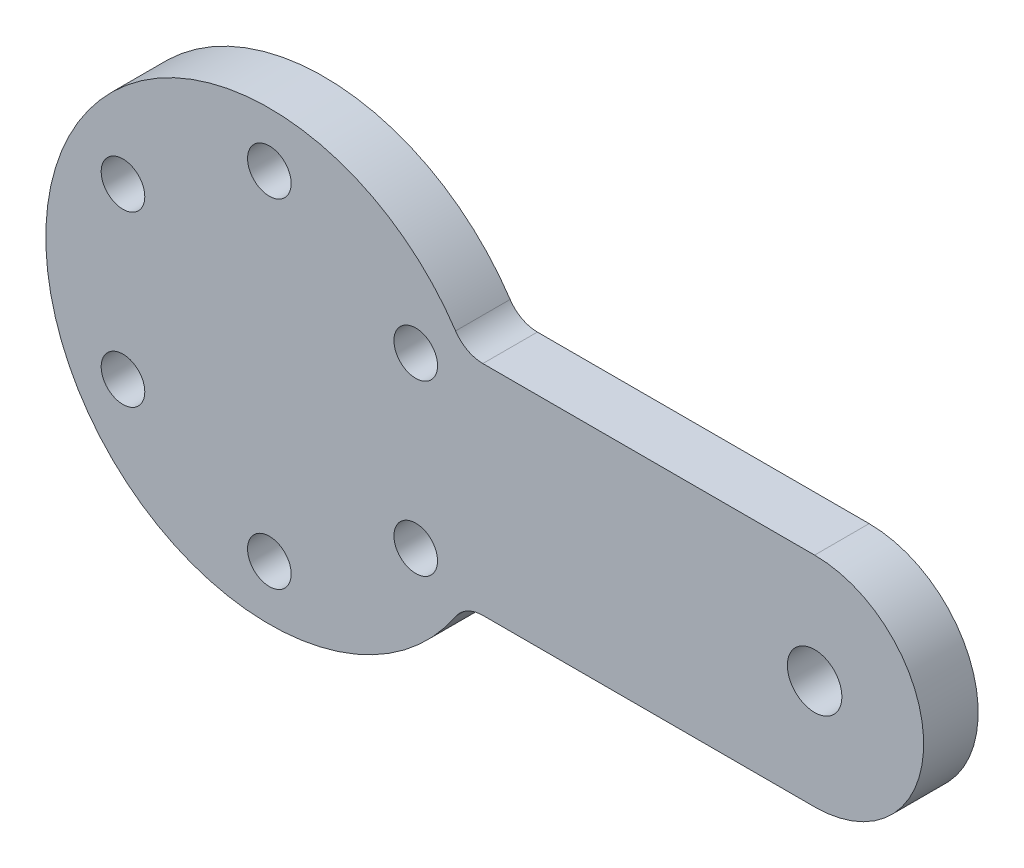
ISO-10303-21;
HEADER;
FILE_DESCRIPTION(('STEP AP214'),'2;1');
FILE_NAME('part.step','',(''),(''),'','','');
FILE_SCHEMA(('AUTOMOTIVE_DESIGN { 1 0 10303 214 1 1 1 1 }'));
ENDSEC;
DATA;
#1=APPLICATION_CONTEXT('core data for automotive mechanical design processes');
#2=APPLICATION_PROTOCOL_DEFINITION('international standard','automotive_design',2000,#1);
#3=PRODUCT_CONTEXT('',#1,'mechanical');
#4=PRODUCT('Part','Part','',(#3));
#5=PRODUCT_RELATED_PRODUCT_CATEGORY('part','',(#4));
#6=PRODUCT_DEFINITION_FORMATION('','',#4);
#7=PRODUCT_DEFINITION_CONTEXT('part definition',#1,'design');
#8=PRODUCT_DEFINITION('design','',#6,#7);
#9=PRODUCT_DEFINITION_SHAPE('','',#8);
#10=(LENGTH_UNIT() NAMED_UNIT(*) SI_UNIT(.MILLI.,.METRE.));
#11=(NAMED_UNIT(*) PLANE_ANGLE_UNIT() SI_UNIT($,.RADIAN.));
#12=(NAMED_UNIT(*) SI_UNIT($,.STERADIAN.) SOLID_ANGLE_UNIT());
#13=UNCERTAINTY_MEASURE_WITH_UNIT(LENGTH_MEASURE(1.E-05),#10,'distance_accuracy_value','');
#14=(GEOMETRIC_REPRESENTATION_CONTEXT(3) GLOBAL_UNCERTAINTY_ASSIGNED_CONTEXT((#13)) GLOBAL_UNIT_ASSIGNED_CONTEXT((#10,
#11,#12)) REPRESENTATION_CONTEXT('',''));
#15=CARTESIAN_POINT('',(0.,0.,0.));
#16=DIRECTION('',(0.,0.,1.));
#17=DIRECTION('',(1.,0.,0.));
#18=AXIS2_PLACEMENT_3D('',#15,#16,#17);
#19=CARTESIAN_POINT('',(0.,0.,2.5));
#20=DIRECTION('',(0.,0.,1.));
#21=DIRECTION('',(1.,0.,0.));
#22=AXIS2_PLACEMENT_3D('',#19,#20,#21);
#23=PLANE('',#22);
#24=CARTESIAN_POINT('',(13.4233937586587,7.75000000000016,2.5));
#25=DIRECTION('',(0.,0.,1.));
#26=DIRECTION('',(0.50000000000001,-0.866025403784433,0.));
#27=AXIS2_PLACEMENT_3D('',#24,#25,#26);
#28=CIRCLE('',#27,2.);
#29=CARTESIAN_POINT('',(14.4233937586587,6.01794919243129,2.5));
#30=VERTEX_POINT('',#29);
#31=EDGE_CURVE('E302',#30,#30,#28,.T.);
#32=ORIENTED_EDGE('',*,*,#31,.F.);
#33=EDGE_LOOP('',(#32));
#34=FACE_BOUND('',#33,.T.);
#35=CARTESIAN_POINT('',(13.4233937586589,-7.74999999999987,2.5));
#36=DIRECTION('',(0.,0.,1.));
#37=DIRECTION('',(-0.499999999999992,-0.866025403784443,0.));
#38=AXIS2_PLACEMENT_3D('',#35,#36,#37);
#39=CIRCLE('',#38,2.);
#40=CARTESIAN_POINT('',(12.4233937586589,-9.48205080756876,2.5));
#41=VERTEX_POINT('',#40);
#42=EDGE_CURVE('E288',#41,#41,#39,.T.);
#43=ORIENTED_EDGE('',*,*,#42,.F.);
#44=EDGE_LOOP('',(#43));
#45=FACE_BOUND('',#44,.T.);
#46=CARTESIAN_POINT('',(0.,-15.5,2.5));
#47=DIRECTION('',(0.,0.,1.));
#48=DIRECTION('',(-1.,0.,0.));
#49=AXIS2_PLACEMENT_3D('',#46,#47,#48);
#50=CIRCLE('',#49,2.);
#51=CARTESIAN_POINT('',(-2.,-15.5,2.5));
#52=VERTEX_POINT('',#51);
#53=EDGE_CURVE('E293',#52,#52,#50,.T.);
#54=ORIENTED_EDGE('',*,*,#53,.F.);
#55=EDGE_LOOP('',(#54));
#56=FACE_BOUND('',#55,.T.);
#57=CARTESIAN_POINT('',(-13.4233937586588,-7.75000000000006,2.5));
#58=DIRECTION('',(0.,0.,1.));
#59=DIRECTION('',(-0.500000000000004,0.866025403784436,0.));
#60=AXIS2_PLACEMENT_3D('',#57,#58,#59);
#61=CIRCLE('',#60,2.);
#62=CARTESIAN_POINT('',(-14.4233937586588,-6.01794919243119,2.5));
#63=VERTEX_POINT('',#62);
#64=EDGE_CURVE('E338',#63,#63,#61,.T.);
#65=ORIENTED_EDGE('',*,*,#64,.F.);
#66=EDGE_LOOP('',(#65));
#67=FACE_BOUND('',#66,.T.);
#68=CARTESIAN_POINT('',(-13.4233937586588,7.74999999999997,2.5));
#69=DIRECTION('',(0.,0.,1.));
#70=DIRECTION('',(0.499999999999998,0.86602540378444,0.));
#71=AXIS2_PLACEMENT_3D('',#68,#69,#70);
#72=CIRCLE('',#71,2.);
#73=CARTESIAN_POINT('',(-12.4233937586588,9.48205080756885,2.5));
#74=VERTEX_POINT('',#73);
#75=EDGE_CURVE('E307',#74,#74,#72,.T.);
#76=ORIENTED_EDGE('',*,*,#75,.F.);
#77=EDGE_LOOP('',(#76));
#78=FACE_BOUND('',#77,.T.);
#79=CARTESIAN_POINT('',(0.,15.5,2.5));
#80=DIRECTION('',(0.,0.,1.));
#81=DIRECTION('',(1.,0.,0.));
#82=AXIS2_PLACEMENT_3D('',#79,#80,#81);
#83=CIRCLE('',#82,2.);
#84=CARTESIAN_POINT('',(2.,15.5,2.5));
#85=VERTEX_POINT('',#84);
#86=EDGE_CURVE('E314',#85,#85,#83,.T.);
#87=ORIENTED_EDGE('',*,*,#86,.F.);
#88=EDGE_LOOP('',(#87));
#89=FACE_BOUND('',#88,.T.);
#90=DIRECTION('',(-1.,0.,0.));
#91=VECTOR('',#90,1.);
#92=CARTESIAN_POINT('',(17.8955301681733,10.,2.5));
#93=LINE('',#92,#91);
#94=CARTESIAN_POINT('',(50.,10.,2.5));
#95=VERTEX_POINT('',#94);
#96=CARTESIAN_POINT('',(19.5767719504519,10.,2.5));
#97=VERTEX_POINT('',#96);
#98=EDGE_CURVE('E114',#95,#97,#93,.T.);
#99=ORIENTED_EDGE('',*,*,#98,.T.);
#100=CARTESIAN_POINT('',(19.5767719504519,13.,2.5));
#101=DIRECTION('',(0.,0.,1.));
#102=DIRECTION('',(1.,0.,0.));
#103=AXIS2_PLACEMENT_3D('',#100,#101,#102);
#104=CIRCLE('',#103,3.);
#105=CARTESIAN_POINT('',(17.0776095737985,11.3404255319149,2.5));
#106=VERTEX_POINT('',#105);
#107=EDGE_CURVE('E11',#97,#106,#104,.F.);
#108=ORIENTED_EDGE('',*,*,#107,.T.);
#109=CARTESIAN_POINT('',(0.,0.,2.5));
#110=DIRECTION('',(0.,0.,1.));
#111=DIRECTION('',(1.,0.,0.));
#112=AXIS2_PLACEMENT_3D('',#109,#110,#111);
#113=CIRCLE('',#112,20.5);
#114=CARTESIAN_POINT('',(17.0776095737985,-11.3404255319149,2.5));
#115=VERTEX_POINT('',#114);
#116=EDGE_CURVE('E100',#106,#115,#113,.T.);
#117=ORIENTED_EDGE('',*,*,#116,.T.);
#118=CARTESIAN_POINT('',(19.5767719504519,-13.,2.5));
#119=DIRECTION('',(0.,0.,1.));
#120=DIRECTION('',(1.,0.,0.));
#121=AXIS2_PLACEMENT_3D('',#118,#119,#120);
#122=CIRCLE('',#121,3.);
#123=CARTESIAN_POINT('',(19.5767719504519,-10.,2.5));
#124=VERTEX_POINT('',#123);
#125=EDGE_CURVE('E96',#115,#124,#122,.F.);
#126=ORIENTED_EDGE('',*,*,#125,.T.);
#127=DIRECTION('',(1.,0.,0.));
#128=VECTOR('',#127,1.);
#129=CARTESIAN_POINT('',(17.8955301681733,-10.,2.5));
#130=LINE('',#129,#128);
#131=CARTESIAN_POINT('',(50.,-10.,2.5));
#132=VERTEX_POINT('',#131);
#133=EDGE_CURVE('E88',#124,#132,#130,.T.);
#134=ORIENTED_EDGE('',*,*,#133,.T.);
#135=CARTESIAN_POINT('',(50.,0.,2.5));
#136=DIRECTION('',(0.,0.,1.));
#137=DIRECTION('',(1.,0.,0.));
#138=AXIS2_PLACEMENT_3D('',#135,#136,#137);
#139=CIRCLE('',#138,10.);
#140=EDGE_CURVE('E92',#132,#95,#139,.T.);
#141=ORIENTED_EDGE('',*,*,#140,.T.);
#142=EDGE_LOOP('',(#99,#108,#117,#126,#134,#141));
#143=FACE_BOUND('',#142,.T.);
#144=CARTESIAN_POINT('',(50.,0.,2.5));
#145=DIRECTION('',(0.,0.,1.));
#146=DIRECTION('',(1.,0.,0.));
#147=AXIS2_PLACEMENT_3D('',#144,#145,#146);
#148=CIRCLE('',#147,2.49999999999999);
#149=CARTESIAN_POINT('',(52.5,0.,2.5));
#150=VERTEX_POINT('',#149);
#151=EDGE_CURVE('E122',#150,#150,#148,.T.);
#152=ORIENTED_EDGE('',*,*,#151,.F.);
#153=EDGE_LOOP('',(#152));
#154=FACE_BOUND('',#153,.T.);
#155=ADVANCED_FACE('F36',(#34,#45,#56,#67,#78,#89,#143,#154),#23,.T.);
#156=CARTESIAN_POINT('',(0.,0.,-2.5));
#157=DIRECTION('',(0.,0.,1.));
#158=DIRECTION('',(1.,0.,0.));
#159=AXIS2_PLACEMENT_3D('',#156,#157,#158);
#160=PLANE('',#159);
#161=CARTESIAN_POINT('',(13.4233937586587,7.75000000000016,-2.5));
#162=DIRECTION('',(0.,0.,1.));
#163=DIRECTION('',(1.,0.,0.));
#164=AXIS2_PLACEMENT_3D('',#161,#162,#163);
#165=CIRCLE('',#164,2.);
#166=CARTESIAN_POINT('',(15.4233937586587,7.75000000000016,-2.5));
#167=VERTEX_POINT('',#166);
#168=EDGE_CURVE('E298',#167,#167,#165,.F.);
#169=ORIENTED_EDGE('',*,*,#168,.F.);
#170=EDGE_LOOP('',(#169));
#171=FACE_BOUND('',#170,.T.);
#172=CARTESIAN_POINT('',(13.4233937586589,-7.74999999999987,-2.5));
#173=DIRECTION('',(0.,0.,1.));
#174=DIRECTION('',(1.,0.,0.));
#175=AXIS2_PLACEMENT_3D('',#172,#173,#174);
#176=CIRCLE('',#175,2.);
#177=CARTESIAN_POINT('',(15.4233937586589,-7.74999999999987,-2.5));
#178=VERTEX_POINT('',#177);
#179=EDGE_CURVE('E291',#178,#178,#176,.F.);
#180=ORIENTED_EDGE('',*,*,#179,.F.);
#181=EDGE_LOOP('',(#180));
#182=FACE_BOUND('',#181,.T.);
#183=CARTESIAN_POINT('',(0.,-15.5,-2.5));
#184=DIRECTION('',(0.,0.,1.));
#185=DIRECTION('',(1.,0.,0.));
#186=AXIS2_PLACEMENT_3D('',#183,#184,#185);
#187=CIRCLE('',#186,2.);
#188=CARTESIAN_POINT('',(2.,-15.5,-2.5));
#189=VERTEX_POINT('',#188);
#190=EDGE_CURVE('E296',#189,#189,#187,.F.);
#191=ORIENTED_EDGE('',*,*,#190,.F.);
#192=EDGE_LOOP('',(#191));
#193=FACE_BOUND('',#192,.T.);
#194=CARTESIAN_POINT('',(-13.4233937586588,-7.75000000000006,-2.5));
#195=DIRECTION('',(0.,0.,1.));
#196=DIRECTION('',(1.,0.,0.));
#197=AXIS2_PLACEMENT_3D('',#194,#195,#196);
#198=CIRCLE('',#197,2.);
#199=CARTESIAN_POINT('',(-11.4233937586588,-7.75000000000006,-2.5));
#200=VERTEX_POINT('',#199);
#201=EDGE_CURVE('E311',#200,#200,#198,.F.);
#202=ORIENTED_EDGE('',*,*,#201,.F.);
#203=EDGE_LOOP('',(#202));
#204=FACE_BOUND('',#203,.T.);
#205=CARTESIAN_POINT('',(-13.4233937586588,7.74999999999997,-2.5));
#206=DIRECTION('',(0.,0.,1.));
#207=DIRECTION('',(1.,0.,0.));
#208=AXIS2_PLACEMENT_3D('',#205,#206,#207);
#209=CIRCLE('',#208,2.);
#210=CARTESIAN_POINT('',(-11.4233937586588,7.74999999999997,-2.5));
#211=VERTEX_POINT('',#210);
#212=EDGE_CURVE('E310',#211,#211,#209,.F.);
#213=ORIENTED_EDGE('',*,*,#212,.F.);
#214=EDGE_LOOP('',(#213));
#215=FACE_BOUND('',#214,.T.);
#216=CARTESIAN_POINT('',(0.,15.5,-2.5));
#217=DIRECTION('',(0.,0.,1.));
#218=DIRECTION('',(1.,0.,0.));
#219=AXIS2_PLACEMENT_3D('',#216,#217,#218);
#220=CIRCLE('',#219,2.);
#221=CARTESIAN_POINT('',(2.,15.5,-2.5));
#222=VERTEX_POINT('',#221);
#223=EDGE_CURVE('E317',#222,#222,#220,.F.);
#224=ORIENTED_EDGE('',*,*,#223,.F.);
#225=EDGE_LOOP('',(#224));
#226=FACE_BOUND('',#225,.T.);
#227=CARTESIAN_POINT('',(0.,0.,-2.5));
#228=DIRECTION('',(0.,0.,1.));
#229=DIRECTION('',(1.,0.,0.));
#230=AXIS2_PLACEMENT_3D('',#227,#228,#229);
#231=CIRCLE('',#230,20.5);
#232=CARTESIAN_POINT('',(17.0776095737985,11.3404255319149,-2.5));
#233=VERTEX_POINT('',#232);
#234=CARTESIAN_POINT('',(17.0776095737985,-11.3404255319149,-2.5));
#235=VERTEX_POINT('',#234);
#236=EDGE_CURVE('E119',#233,#235,#231,.T.);
#237=ORIENTED_EDGE('',*,*,#236,.F.);
#238=CARTESIAN_POINT('',(19.5767719504519,13.,-2.5));
#239=DIRECTION('',(0.,0.,1.));
#240=DIRECTION('',(1.,0.,0.));
#241=AXIS2_PLACEMENT_3D('',#238,#239,#240);
#242=CIRCLE('',#241,3.);
#243=CARTESIAN_POINT('',(19.5767719504519,10.,-2.5));
#244=VERTEX_POINT('',#243);
#245=EDGE_CURVE('E44',#233,#244,#242,.T.);
#246=ORIENTED_EDGE('',*,*,#245,.T.);
#247=DIRECTION('',(-1.,0.,0.));
#248=VECTOR('',#247,1.);
#249=CARTESIAN_POINT('',(17.8955301681733,10.,-2.5));
#250=LINE('',#249,#248);
#251=CARTESIAN_POINT('',(50.,10.,-2.5));
#252=VERTEX_POINT('',#251);
#253=EDGE_CURVE('E126',#252,#244,#250,.T.);
#254=ORIENTED_EDGE('',*,*,#253,.F.);
#255=CARTESIAN_POINT('',(50.,0.,-2.5));
#256=DIRECTION('',(0.,0.,1.));
#257=DIRECTION('',(1.,0.,0.));
#258=AXIS2_PLACEMENT_3D('',#255,#256,#257);
#259=CIRCLE('',#258,10.);
#260=CARTESIAN_POINT('',(50.,-10.,-2.5));
#261=VERTEX_POINT('',#260);
#262=EDGE_CURVE('E124',#261,#252,#259,.T.);
#263=ORIENTED_EDGE('',*,*,#262,.F.);
#264=DIRECTION('',(1.,0.,0.));
#265=VECTOR('',#264,1.);
#266=CARTESIAN_POINT('',(17.8955301681733,-10.,-2.5));
#267=LINE('',#266,#265);
#268=CARTESIAN_POINT('',(19.5767719504519,-10.,-2.5));
#269=VERTEX_POINT('',#268);
#270=EDGE_CURVE('E106',#269,#261,#267,.T.);
#271=ORIENTED_EDGE('',*,*,#270,.F.);
#272=CARTESIAN_POINT('',(19.5767719504519,-13.,-2.5));
#273=DIRECTION('',(0.,0.,1.));
#274=DIRECTION('',(1.,0.,0.));
#275=AXIS2_PLACEMENT_3D('',#272,#273,#274);
#276=CIRCLE('',#275,3.);
#277=EDGE_CURVE('E136',#269,#235,#276,.T.);
#278=ORIENTED_EDGE('',*,*,#277,.T.);
#279=EDGE_LOOP('',(#237,#246,#254,#263,#271,#278));
#280=FACE_BOUND('',#279,.T.);
#281=CARTESIAN_POINT('',(50.,0.,-2.5));
#282=DIRECTION('',(0.,0.,1.));
#283=DIRECTION('',(1.,0.,0.));
#284=AXIS2_PLACEMENT_3D('',#281,#282,#283);
#285=CIRCLE('',#284,2.49999999999999);
#286=CARTESIAN_POINT('',(52.5,0.,-2.5));
#287=VERTEX_POINT('',#286);
#288=EDGE_CURVE('E320',#287,#287,#285,.T.);
#289=ORIENTED_EDGE('',*,*,#288,.T.);
#290=EDGE_LOOP('',(#289));
#291=FACE_BOUND('',#290,.T.);
#292=ADVANCED_FACE('F138',(#171,#182,#193,#204,#215,#226,#280,#291),#160,.F.);
#293=CARTESIAN_POINT('',(0.,0.,2.5));
#294=DIRECTION('',(0.,0.,-1.));
#295=DIRECTION('',(-1.,0.,0.));
#296=AXIS2_PLACEMENT_3D('',#293,#294,#295);
#297=CYLINDRICAL_SURFACE('',#296,20.5);
#298=ORIENTED_EDGE('',*,*,#236,.T.);
#299=DIRECTION('',(0.,0.,-1.));
#300=VECTOR('',#299,1.);
#301=CARTESIAN_POINT('',(17.0776095737985,-11.3404255319149,2.5));
#302=LINE('',#301,#300);
#303=EDGE_CURVE('E133',#235,#115,#302,.F.);
#304=ORIENTED_EDGE('',*,*,#303,.T.);
#305=ORIENTED_EDGE('',*,*,#116,.F.);
#306=DIRECTION('',(0.,0.,-1.));
#307=VECTOR('',#306,1.);
#308=CARTESIAN_POINT('',(17.0776095737985,11.3404255319149,2.5));
#309=LINE('',#308,#307);
#310=EDGE_CURVE('E130',#106,#233,#309,.T.);
#311=ORIENTED_EDGE('',*,*,#310,.T.);
#312=EDGE_LOOP('',(#298,#304,#305,#311));
#313=FACE_BOUND('',#312,.T.);
#314=ADVANCED_FACE('F143',(#313),#297,.T.);
#315=CARTESIAN_POINT('',(17.8955301681733,-10.,2.5));
#316=DIRECTION('',(0.,1.,0.));
#317=DIRECTION('',(-1.,0.,0.));
#318=AXIS2_PLACEMENT_3D('',#315,#316,#317);
#319=PLANE('',#318);
#320=ORIENTED_EDGE('',*,*,#133,.F.);
#321=DIRECTION('',(0.,0.,1.));
#322=VECTOR('',#321,1.);
#323=CARTESIAN_POINT('',(19.5767719504519,-10.,-2.5));
#324=LINE('',#323,#322);
#325=EDGE_CURVE('E109',#124,#269,#324,.F.);
#326=ORIENTED_EDGE('',*,*,#325,.T.);
#327=ORIENTED_EDGE('',*,*,#270,.T.);
#328=DIRECTION('',(0.,0.,-1.));
#329=VECTOR('',#328,1.);
#330=CARTESIAN_POINT('',(50.,-10.,2.5));
#331=LINE('',#330,#329);
#332=EDGE_CURVE('E103',#132,#261,#331,.T.);
#333=ORIENTED_EDGE('',*,*,#332,.F.);
#334=EDGE_LOOP('',(#320,#326,#327,#333));
#335=FACE_BOUND('',#334,.T.);
#336=ADVANCED_FACE('F104',(#335),#319,.F.);
#337=CARTESIAN_POINT('',(50.,0.,2.5));
#338=DIRECTION('',(0.,0.,-1.));
#339=DIRECTION('',(-1.,0.,0.));
#340=AXIS2_PLACEMENT_3D('',#337,#338,#339);
#341=CYLINDRICAL_SURFACE('',#340,10.);
#342=ORIENTED_EDGE('',*,*,#262,.T.);
#343=DIRECTION('',(0.,0.,-1.));
#344=VECTOR('',#343,1.);
#345=CARTESIAN_POINT('',(50.,10.,2.5));
#346=LINE('',#345,#344);
#347=EDGE_CURVE('E110',#95,#252,#346,.T.);
#348=ORIENTED_EDGE('',*,*,#347,.F.);
#349=ORIENTED_EDGE('',*,*,#140,.F.);
#350=ORIENTED_EDGE('',*,*,#332,.T.);
#351=EDGE_LOOP('',(#342,#348,#349,#350));
#352=FACE_BOUND('',#351,.T.);
#353=ADVANCED_FACE('F112',(#352),#341,.T.);
#354=CARTESIAN_POINT('',(17.8955301681733,10.,2.5));
#355=DIRECTION('',(0.,-1.,0.));
#356=DIRECTION('',(0.,0.,-1.));
#357=AXIS2_PLACEMENT_3D('',#354,#355,#356);
#358=PLANE('',#357);
#359=ORIENTED_EDGE('',*,*,#253,.T.);
#360=DIRECTION('',(0.,0.,1.));
#361=VECTOR('',#360,1.);
#362=CARTESIAN_POINT('',(19.5767719504519,10.,2.5));
#363=LINE('',#362,#361);
#364=EDGE_CURVE('E51',#244,#97,#363,.T.);
#365=ORIENTED_EDGE('',*,*,#364,.T.);
#366=ORIENTED_EDGE('',*,*,#98,.F.);
#367=ORIENTED_EDGE('',*,*,#347,.T.);
#368=EDGE_LOOP('',(#359,#365,#366,#367));
#369=FACE_BOUND('',#368,.T.);
#370=ADVANCED_FACE('F172',(#369),#358,.F.);
#371=CARTESIAN_POINT('',(50.,0.,2.5));
#372=DIRECTION('',(0.,0.,-1.));
#373=DIRECTION('',(-1.,0.,0.));
#374=AXIS2_PLACEMENT_3D('',#371,#372,#373);
#375=CYLINDRICAL_SURFACE('',#374,2.49999999999999);
#376=ORIENTED_EDGE('',*,*,#151,.T.);
#377=EDGE_LOOP('',(#376));
#378=FACE_BOUND('',#377,.T.);
#379=ORIENTED_EDGE('',*,*,#288,.F.);
#380=EDGE_LOOP('',(#379));
#381=FACE_BOUND('',#380,.T.);
#382=ADVANCED_FACE('F169',(#378,#381),#375,.F.);
#383=CARTESIAN_POINT('',(0.,15.5,-2.501));
#384=DIRECTION('',(0.,0.,1.));
#385=DIRECTION('',(1.,0.,0.));
#386=AXIS2_PLACEMENT_3D('',#383,#384,#385);
#387=CYLINDRICAL_SURFACE('',#386,2.);
#388=ORIENTED_EDGE('',*,*,#86,.T.);
#389=EDGE_LOOP('',(#388));
#390=FACE_BOUND('',#389,.T.);
#391=ORIENTED_EDGE('',*,*,#223,.T.);
#392=EDGE_LOOP('',(#391));
#393=FACE_BOUND('',#392,.T.);
#394=ADVANCED_FACE('F201',(#390,#393),#387,.F.);
#395=CARTESIAN_POINT('',(-13.4233937586588,7.74999999999997,-2.501));
#396=DIRECTION('',(0.,0.,1.));
#397=DIRECTION('',(1.,0.,0.));
#398=AXIS2_PLACEMENT_3D('',#395,#396,#397);
#399=CYLINDRICAL_SURFACE('',#398,2.);
#400=ORIENTED_EDGE('',*,*,#75,.T.);
#401=EDGE_LOOP('',(#400));
#402=FACE_BOUND('',#401,.T.);
#403=ORIENTED_EDGE('',*,*,#212,.T.);
#404=EDGE_LOOP('',(#403));
#405=FACE_BOUND('',#404,.T.);
#406=ADVANCED_FACE('F208',(#402,#405),#399,.F.);
#407=CARTESIAN_POINT('',(-13.4233937586588,-7.75000000000006,-2.501));
#408=DIRECTION('',(0.,0.,1.));
#409=DIRECTION('',(1.,0.,0.));
#410=AXIS2_PLACEMENT_3D('',#407,#408,#409);
#411=CYLINDRICAL_SURFACE('',#410,2.);
#412=ORIENTED_EDGE('',*,*,#64,.T.);
#413=EDGE_LOOP('',(#412));
#414=FACE_BOUND('',#413,.T.);
#415=ORIENTED_EDGE('',*,*,#201,.T.);
#416=EDGE_LOOP('',(#415));
#417=FACE_BOUND('',#416,.T.);
#418=ADVANCED_FACE('F215',(#414,#417),#411,.F.);
#419=CARTESIAN_POINT('',(0.,-15.5,-2.501));
#420=DIRECTION('',(0.,0.,1.));
#421=DIRECTION('',(1.,0.,0.));
#422=AXIS2_PLACEMENT_3D('',#419,#420,#421);
#423=CYLINDRICAL_SURFACE('',#422,2.);
#424=ORIENTED_EDGE('',*,*,#53,.T.);
#425=EDGE_LOOP('',(#424));
#426=FACE_BOUND('',#425,.T.);
#427=ORIENTED_EDGE('',*,*,#190,.T.);
#428=EDGE_LOOP('',(#427));
#429=FACE_BOUND('',#428,.T.);
#430=ADVANCED_FACE('F223',(#426,#429),#423,.F.);
#431=CARTESIAN_POINT('',(13.4233937586589,-7.74999999999987,-2.501));
#432=DIRECTION('',(0.,0.,1.));
#433=DIRECTION('',(1.,0.,0.));
#434=AXIS2_PLACEMENT_3D('',#431,#432,#433);
#435=CYLINDRICAL_SURFACE('',#434,2.);
#436=ORIENTED_EDGE('',*,*,#42,.T.);
#437=EDGE_LOOP('',(#436));
#438=FACE_BOUND('',#437,.T.);
#439=ORIENTED_EDGE('',*,*,#179,.T.);
#440=EDGE_LOOP('',(#439));
#441=FACE_BOUND('',#440,.T.);
#442=ADVANCED_FACE('F154',(#438,#441),#435,.F.);
#443=CARTESIAN_POINT('',(13.4233937586587,7.75000000000016,-2.501));
#444=DIRECTION('',(0.,0.,1.));
#445=DIRECTION('',(1.,0.,0.));
#446=AXIS2_PLACEMENT_3D('',#443,#444,#445);
#447=CYLINDRICAL_SURFACE('',#446,2.);
#448=ORIENTED_EDGE('',*,*,#31,.T.);
#449=EDGE_LOOP('',(#448));
#450=FACE_BOUND('',#449,.T.);
#451=ORIENTED_EDGE('',*,*,#168,.T.);
#452=EDGE_LOOP('',(#451));
#453=FACE_BOUND('',#452,.T.);
#454=ADVANCED_FACE('F148',(#450,#453),#447,.F.);
#455=CARTESIAN_POINT('',(19.5767719504519,-13.,2.5));
#456=DIRECTION('',(0.,0.,-1.));
#457=DIRECTION('',(-1.,0.,0.));
#458=AXIS2_PLACEMENT_3D('',#455,#456,#457);
#459=CYLINDRICAL_SURFACE('',#458,3.);
#460=ORIENTED_EDGE('',*,*,#125,.F.);
#461=ORIENTED_EDGE('',*,*,#303,.F.);
#462=ORIENTED_EDGE('',*,*,#277,.F.);
#463=ORIENTED_EDGE('',*,*,#325,.F.);
#464=EDGE_LOOP('',(#460,#461,#462,#463));
#465=FACE_BOUND('',#464,.T.);
#466=ADVANCED_FACE('F146',(#465),#459,.F.);
#467=CARTESIAN_POINT('',(19.5767719504519,13.,2.5));
#468=DIRECTION('',(0.,0.,-1.));
#469=DIRECTION('',(-1.,0.,0.));
#470=AXIS2_PLACEMENT_3D('',#467,#468,#469);
#471=CYLINDRICAL_SURFACE('',#470,3.);
#472=ORIENTED_EDGE('',*,*,#107,.F.);
#473=ORIENTED_EDGE('',*,*,#364,.F.);
#474=ORIENTED_EDGE('',*,*,#245,.F.);
#475=ORIENTED_EDGE('',*,*,#310,.F.);
#476=EDGE_LOOP('',(#472,#473,#474,#475));
#477=FACE_BOUND('',#476,.T.);
#478=ADVANCED_FACE('F38',(#477),#471,.F.);
#479=CLOSED_SHELL('',(#155,#292,#314,#336,#353,#370,#382,#394,#406,#418,#430,#442,#454,#466,#478));
#480=MANIFOLD_SOLID_BREP('B2',#479);
#481=ADVANCED_BREP_SHAPE_REPRESENTATION('',(#18,#480),#14);
#482=SHAPE_DEFINITION_REPRESENTATION(#9,#481);
ENDSEC;
END-ISO-10303-21;
